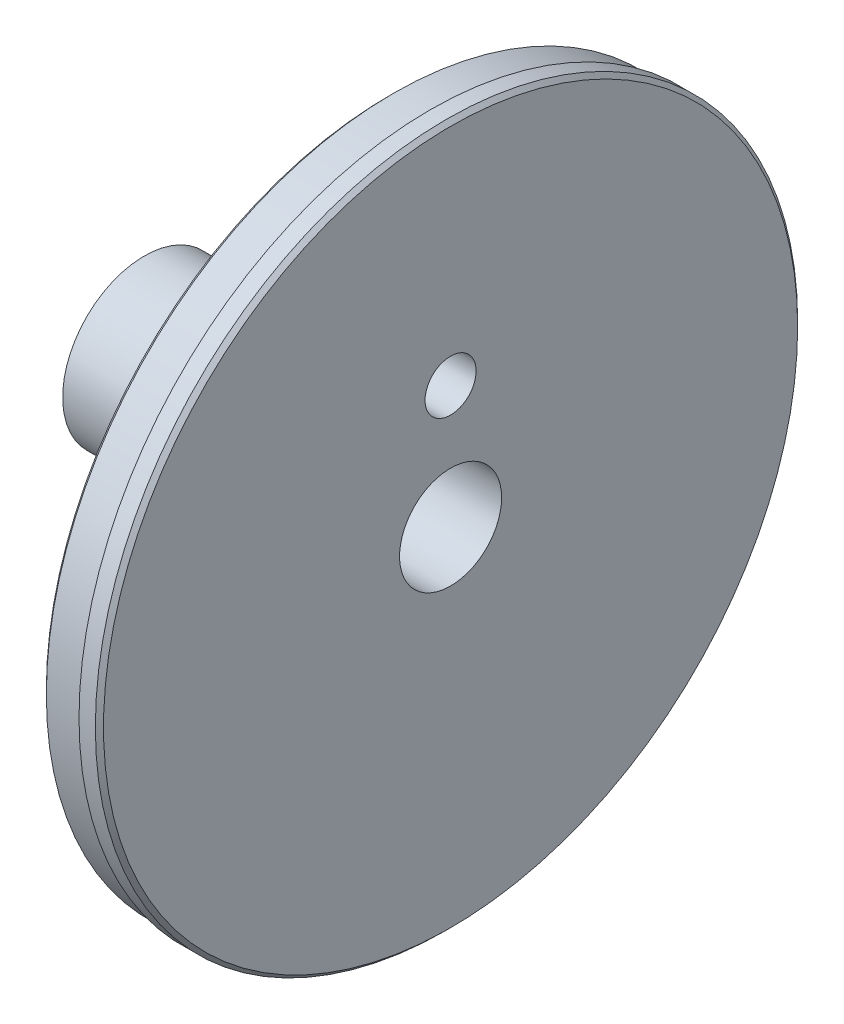
ISO-10303-21;
HEADER;
FILE_DESCRIPTION(('STEP AP214'),'2;1');
FILE_NAME('part.step','',(''),(''),'','','');
FILE_SCHEMA(('AUTOMOTIVE_DESIGN { 1 0 10303 214 1 1 1 1 }'));
ENDSEC;
DATA;
#1=APPLICATION_CONTEXT('core data for automotive mechanical design processes');
#2=APPLICATION_PROTOCOL_DEFINITION('international standard','automotive_design',2000,#1);
#3=PRODUCT_CONTEXT('',#1,'mechanical');
#4=PRODUCT('Part','Part','',(#3));
#5=PRODUCT_RELATED_PRODUCT_CATEGORY('part','',(#4));
#6=PRODUCT_DEFINITION_FORMATION('','',#4);
#7=PRODUCT_DEFINITION_CONTEXT('part definition',#1,'design');
#8=PRODUCT_DEFINITION('design','',#6,#7);
#9=PRODUCT_DEFINITION_SHAPE('','',#8);
#10=(LENGTH_UNIT() NAMED_UNIT(*) SI_UNIT(.MILLI.,.METRE.));
#11=(NAMED_UNIT(*) PLANE_ANGLE_UNIT() SI_UNIT($,.RADIAN.));
#12=(NAMED_UNIT(*) SI_UNIT($,.STERADIAN.) SOLID_ANGLE_UNIT());
#13=UNCERTAINTY_MEASURE_WITH_UNIT(LENGTH_MEASURE(1.E-05),#10,'distance_accuracy_value','');
#14=(GEOMETRIC_REPRESENTATION_CONTEXT(3) GLOBAL_UNCERTAINTY_ASSIGNED_CONTEXT((#13)) GLOBAL_UNIT_ASSIGNED_CONTEXT((#10,
#11,#12)) REPRESENTATION_CONTEXT('',''));
#15=CARTESIAN_POINT('',(0.,0.,0.));
#16=DIRECTION('',(0.,0.,1.));
#17=DIRECTION('',(1.,0.,0.));
#18=AXIS2_PLACEMENT_3D('',#15,#16,#17);
#19=CARTESIAN_POINT('',(0.,0.,0.));
#20=DIRECTION('',(1.,0.,0.));
#21=DIRECTION('',(0.,0.,-1.));
#22=AXIS2_PLACEMENT_3D('',#19,#20,#21);
#23=CYLINDRICAL_SURFACE('',#22,2.5);
#24=CARTESIAN_POINT('',(0.,0.,0.));
#25=DIRECTION('',(1.,0.,0.));
#26=DIRECTION('',(0.,0.,-1.));
#27=AXIS2_PLACEMENT_3D('',#24,#25,#26);
#28=CIRCLE('',#27,2.5);
#29=CARTESIAN_POINT('',(0.,0.,-2.5));
#30=VERTEX_POINT('',#29);
#31=EDGE_CURVE('E54',#30,#30,#28,.T.);
#32=ORIENTED_EDGE('',*,*,#31,.T.);
#33=EDGE_LOOP('',(#32));
#34=FACE_BOUND('',#33,.T.);
#35=CARTESIAN_POINT('',(-15.,0.,0.));
#36=DIRECTION('',(1.,0.,0.));
#37=DIRECTION('',(0.,0.,-1.));
#38=AXIS2_PLACEMENT_3D('',#35,#36,#37);
#39=CIRCLE('',#38,2.5);
#40=CARTESIAN_POINT('',(-15.,0.,-2.5));
#41=VERTEX_POINT('',#40);
#42=EDGE_CURVE('E75',#41,#41,#39,.T.);
#43=ORIENTED_EDGE('',*,*,#42,.F.);
#44=EDGE_LOOP('',(#43));
#45=FACE_BOUND('',#44,.T.);
#46=ADVANCED_FACE('F33',(#34,#45),#23,.F.);
#47=CARTESIAN_POINT('',(0.,2.5,0.));
#48=DIRECTION('',(1.,0.,0.));
#49=DIRECTION('',(0.,0.,-1.));
#50=AXIS2_PLACEMENT_3D('',#47,#48,#49);
#51=PLANE('',#50);
#52=CARTESIAN_POINT('',(0.,0.,0.));
#53=DIRECTION('',(1.,0.,0.));
#54=DIRECTION('',(0.,0.,-1.));
#55=AXIS2_PLACEMENT_3D('',#52,#53,#54);
#56=CIRCLE('',#55,17.);
#57=CARTESIAN_POINT('',(0.,0.,-17.));
#58=VERTEX_POINT('',#57);
#59=EDGE_CURVE('E41',#58,#58,#56,.T.);
#60=ORIENTED_EDGE('',*,*,#59,.T.);
#61=EDGE_LOOP('',(#60));
#62=FACE_BOUND('',#61,.T.);
#63=CARTESIAN_POINT('',(0.,6.,0.));
#64=DIRECTION('',(-1.,0.,0.));
#65=DIRECTION('',(0.,0.,1.));
#66=AXIS2_PLACEMENT_3D('',#63,#64,#65);
#67=CIRCLE('',#66,1.25);
#68=CARTESIAN_POINT('',(0.,6.,1.25));
#69=VERTEX_POINT('',#68);
#70=EDGE_CURVE('E78',#69,#69,#67,.T.);
#71=ORIENTED_EDGE('',*,*,#70,.T.);
#72=EDGE_LOOP('',(#71));
#73=FACE_BOUND('',#72,.T.);
#74=ORIENTED_EDGE('',*,*,#31,.F.);
#75=EDGE_LOOP('',(#74));
#76=FACE_BOUND('',#75,.T.);
#77=ADVANCED_FACE('F85',(#62,#73,#76),#51,.T.);
#78=CARTESIAN_POINT('',(0.,0.,0.));
#79=DIRECTION('',(1.,0.,0.));
#80=DIRECTION('',(0.,0.,-1.));
#81=AXIS2_PLACEMENT_3D('',#78,#79,#80);
#82=CYLINDRICAL_SURFACE('',#81,17.2);
#83=CARTESIAN_POINT('',(-0.200000000000013,0.,0.));
#84=DIRECTION('',(1.,0.,0.));
#85=DIRECTION('',(0.,0.,-1.));
#86=AXIS2_PLACEMENT_3D('',#83,#84,#85);
#87=CIRCLE('',#86,17.2);
#88=CARTESIAN_POINT('',(-0.200000000000013,0.,-17.2));
#89=VERTEX_POINT('',#88);
#90=EDGE_CURVE('E10',#89,#89,#87,.F.);
#91=ORIENTED_EDGE('',*,*,#90,.T.);
#92=EDGE_LOOP('',(#91));
#93=FACE_BOUND('',#92,.T.);
#94=CARTESIAN_POINT('',(-1.,0.,0.));
#95=DIRECTION('',(1.,0.,0.));
#96=DIRECTION('',(0.,0.,-1.));
#97=AXIS2_PLACEMENT_3D('',#94,#95,#96);
#98=CIRCLE('',#97,17.2);
#99=CARTESIAN_POINT('',(-1.,0.,-17.2));
#100=VERTEX_POINT('',#99);
#101=EDGE_CURVE('E57',#100,#100,#98,.T.);
#102=ORIENTED_EDGE('',*,*,#101,.T.);
#103=EDGE_LOOP('',(#102));
#104=FACE_BOUND('',#103,.T.);
#105=ADVANCED_FACE('F130',(#93,#104),#82,.T.);
#106=CARTESIAN_POINT('',(-1.,17.2,0.));
#107=DIRECTION('',(-1.,0.,0.));
#108=DIRECTION('',(0.,0.,1.));
#109=AXIS2_PLACEMENT_3D('',#106,#107,#108);
#110=PLANE('',#109);
#111=CARTESIAN_POINT('',(-1.,0.,0.));
#112=DIRECTION('',(1.,0.,0.));
#113=DIRECTION('',(0.,0.,-1.));
#114=AXIS2_PLACEMENT_3D('',#111,#112,#113);
#115=CIRCLE('',#114,17.);
#116=CARTESIAN_POINT('',(-1.,0.,-17.));
#117=VERTEX_POINT('',#116);
#118=EDGE_CURVE('E60',#117,#117,#115,.T.);
#119=ORIENTED_EDGE('',*,*,#118,.T.);
#120=EDGE_LOOP('',(#119));
#121=FACE_BOUND('',#120,.T.);
#122=ORIENTED_EDGE('',*,*,#101,.F.);
#123=EDGE_LOOP('',(#122));
#124=FACE_BOUND('',#123,.T.);
#125=ADVANCED_FACE('F120',(#121,#124),#110,.T.);
#126=CARTESIAN_POINT('',(0.,0.,0.));
#127=DIRECTION('',(1.,0.,0.));
#128=DIRECTION('',(0.,0.,-1.));
#129=AXIS2_PLACEMENT_3D('',#126,#127,#128);
#130=CYLINDRICAL_SURFACE('',#129,17.);
#131=CARTESIAN_POINT('',(-2.8,0.,0.));
#132=DIRECTION('',(-1.,0.,0.));
#133=DIRECTION('',(0.,0.,1.));
#134=AXIS2_PLACEMENT_3D('',#131,#132,#133);
#135=CIRCLE('',#134,17.);
#136=CARTESIAN_POINT('',(-2.8,0.,17.));
#137=VERTEX_POINT('',#136);
#138=EDGE_CURVE('E49',#137,#137,#135,.F.);
#139=ORIENTED_EDGE('',*,*,#138,.T.);
#140=EDGE_LOOP('',(#139));
#141=FACE_BOUND('',#140,.T.);
#142=ORIENTED_EDGE('',*,*,#118,.F.);
#143=EDGE_LOOP('',(#142));
#144=FACE_BOUND('',#143,.T.);
#145=ADVANCED_FACE('F113',(#141,#144),#130,.T.);
#146=CARTESIAN_POINT('',(-3.,17.,0.));
#147=DIRECTION('',(-1.,0.,0.));
#148=DIRECTION('',(0.,0.,1.));
#149=AXIS2_PLACEMENT_3D('',#146,#147,#148);
#150=PLANE('',#149);
#151=CARTESIAN_POINT('',(-3.,0.,0.));
#152=DIRECTION('',(-1.,0.,0.));
#153=DIRECTION('',(0.,0.,1.));
#154=AXIS2_PLACEMENT_3D('',#151,#152,#153);
#155=CIRCLE('',#154,16.8);
#156=CARTESIAN_POINT('',(-3.,0.,16.8));
#157=VERTEX_POINT('',#156);
#158=EDGE_CURVE('E45',#157,#157,#155,.T.);
#159=ORIENTED_EDGE('',*,*,#158,.T.);
#160=EDGE_LOOP('',(#159));
#161=FACE_BOUND('',#160,.T.);
#162=CARTESIAN_POINT('',(-3.,0.,0.));
#163=DIRECTION('',(1.,0.,0.));
#164=DIRECTION('',(0.,0.,-1.));
#165=AXIS2_PLACEMENT_3D('',#162,#163,#164);
#166=CIRCLE('',#165,9.);
#167=CARTESIAN_POINT('',(-3.,0.,-9.));
#168=VERTEX_POINT('',#167);
#169=EDGE_CURVE('E63',#168,#168,#166,.T.);
#170=ORIENTED_EDGE('',*,*,#169,.T.);
#171=EDGE_LOOP('',(#170));
#172=FACE_BOUND('',#171,.T.);
#173=ADVANCED_FACE('F108',(#161,#172),#150,.T.);
#174=CARTESIAN_POINT('',(0.,0.,0.));
#175=DIRECTION('',(1.,0.,0.));
#176=DIRECTION('',(0.,0.,-1.));
#177=AXIS2_PLACEMENT_3D('',#174,#175,#176);
#178=CYLINDRICAL_SURFACE('',#177,9.);
#179=CARTESIAN_POINT('',(-6.,0.,0.));
#180=DIRECTION('',(1.,0.,0.));
#181=DIRECTION('',(0.,0.,-1.));
#182=AXIS2_PLACEMENT_3D('',#179,#180,#181);
#183=CIRCLE('',#182,9.);
#184=CARTESIAN_POINT('',(-6.,0.,-9.));
#185=VERTEX_POINT('',#184);
#186=EDGE_CURVE('E66',#185,#185,#183,.T.);
#187=ORIENTED_EDGE('',*,*,#186,.T.);
#188=EDGE_LOOP('',(#187));
#189=FACE_BOUND('',#188,.T.);
#190=ORIENTED_EDGE('',*,*,#169,.F.);
#191=EDGE_LOOP('',(#190));
#192=FACE_BOUND('',#191,.T.);
#193=ADVANCED_FACE('F100',(#189,#192),#178,.T.);
#194=CARTESIAN_POINT('',(-6.,9.,0.));
#195=DIRECTION('',(-1.,0.,0.));
#196=DIRECTION('',(0.,0.,1.));
#197=AXIS2_PLACEMENT_3D('',#194,#195,#196);
#198=PLANE('',#197);
#199=CARTESIAN_POINT('',(-6.,6.,0.));
#200=DIRECTION('',(-1.,0.,0.));
#201=DIRECTION('',(0.,0.,1.));
#202=AXIS2_PLACEMENT_3D('',#199,#200,#201);
#203=CIRCLE('',#202,1.25);
#204=CARTESIAN_POINT('',(-6.,6.,1.25));
#205=VERTEX_POINT('',#204);
#206=EDGE_CURVE('E79',#205,#205,#203,.T.);
#207=ORIENTED_EDGE('',*,*,#206,.F.);
#208=EDGE_LOOP('',(#207));
#209=FACE_BOUND('',#208,.T.);
#210=CARTESIAN_POINT('',(-6.,0.,0.));
#211=DIRECTION('',(1.,0.,0.));
#212=DIRECTION('',(0.,0.,-1.));
#213=AXIS2_PLACEMENT_3D('',#210,#211,#212);
#214=CIRCLE('',#213,4.);
#215=CARTESIAN_POINT('',(-6.,0.,-4.));
#216=VERTEX_POINT('',#215);
#217=EDGE_CURVE('E69',#216,#216,#214,.T.);
#218=ORIENTED_EDGE('',*,*,#217,.T.);
#219=EDGE_LOOP('',(#218));
#220=FACE_BOUND('',#219,.T.);
#221=ORIENTED_EDGE('',*,*,#186,.F.);
#222=EDGE_LOOP('',(#221));
#223=FACE_BOUND('',#222,.T.);
#224=ADVANCED_FACE('F96',(#209,#220,#223),#198,.T.);
#225=CARTESIAN_POINT('',(0.,0.,0.));
#226=DIRECTION('',(1.,0.,0.));
#227=DIRECTION('',(0.,0.,-1.));
#228=AXIS2_PLACEMENT_3D('',#225,#226,#227);
#229=CYLINDRICAL_SURFACE('',#228,4.);
#230=CARTESIAN_POINT('',(-15.,0.,0.));
#231=DIRECTION('',(1.,0.,0.));
#232=DIRECTION('',(0.,0.,-1.));
#233=AXIS2_PLACEMENT_3D('',#230,#231,#232);
#234=CIRCLE('',#233,4.);
#235=CARTESIAN_POINT('',(-15.,0.,-4.));
#236=VERTEX_POINT('',#235);
#237=EDGE_CURVE('E72',#236,#236,#234,.T.);
#238=ORIENTED_EDGE('',*,*,#237,.T.);
#239=EDGE_LOOP('',(#238));
#240=FACE_BOUND('',#239,.T.);
#241=ORIENTED_EDGE('',*,*,#217,.F.);
#242=EDGE_LOOP('',(#241));
#243=FACE_BOUND('',#242,.T.);
#244=ADVANCED_FACE('F99',(#240,#243),#229,.T.);
#245=CARTESIAN_POINT('',(-15.,4.,0.));
#246=DIRECTION('',(-1.,0.,0.));
#247=DIRECTION('',(0.,0.,1.));
#248=AXIS2_PLACEMENT_3D('',#245,#246,#247);
#249=PLANE('',#248);
#250=ORIENTED_EDGE('',*,*,#42,.T.);
#251=EDGE_LOOP('',(#250));
#252=FACE_BOUND('',#251,.T.);
#253=ORIENTED_EDGE('',*,*,#237,.F.);
#254=EDGE_LOOP('',(#253));
#255=FACE_BOUND('',#254,.T.);
#256=ADVANCED_FACE('F92',(#252,#255),#249,.T.);
#257=CARTESIAN_POINT('',(0.,6.,0.));
#258=DIRECTION('',(-1.,0.,0.));
#259=DIRECTION('',(0.,0.,1.));
#260=AXIS2_PLACEMENT_3D('',#257,#258,#259);
#261=CYLINDRICAL_SURFACE('',#260,1.25);
#262=ORIENTED_EDGE('',*,*,#70,.F.);
#263=EDGE_LOOP('',(#262));
#264=FACE_BOUND('',#263,.T.);
#265=ORIENTED_EDGE('',*,*,#206,.T.);
#266=EDGE_LOOP('',(#265));
#267=FACE_BOUND('',#266,.T.);
#268=ADVANCED_FACE('F88',(#264,#267),#261,.F.);
#269=CARTESIAN_POINT('',(-2.8,0.,0.));
#270=DIRECTION('',(1.,0.,0.));
#271=DIRECTION('',(0.,0.,-1.));
#272=AXIS2_PLACEMENT_3D('',#269,#270,#271);
#273=CONICAL_SURFACE('',#272,17.,0.785398163397466);
#274=ORIENTED_EDGE('',*,*,#158,.F.);
#275=EDGE_LOOP('',(#274));
#276=FACE_BOUND('',#275,.T.);
#277=ORIENTED_EDGE('',*,*,#138,.F.);
#278=EDGE_LOOP('',(#277));
#279=FACE_BOUND('',#278,.T.);
#280=ADVANCED_FACE('F91',(#276,#279),#273,.T.);
#281=CARTESIAN_POINT('',(0.,0.,0.));
#282=DIRECTION('',(-1.,0.,0.));
#283=DIRECTION('',(0.,0.,1.));
#284=AXIS2_PLACEMENT_3D('',#281,#282,#283);
#285=CONICAL_SURFACE('',#284,17.,0.785398163397431);
#286=ORIENTED_EDGE('',*,*,#90,.F.);
#287=EDGE_LOOP('',(#286));
#288=FACE_BOUND('',#287,.T.);
#289=ORIENTED_EDGE('',*,*,#59,.F.);
#290=EDGE_LOOP('',(#289));
#291=FACE_BOUND('',#290,.T.);
#292=ADVANCED_FACE('F36',(#288,#291),#285,.T.);
#293=CLOSED_SHELL('',(#46,#77,#105,#125,#145,#173,#193,#224,#244,#256,#268,#280,#292));
#294=MANIFOLD_SOLID_BREP('B2',#293);
#295=ADVANCED_BREP_SHAPE_REPRESENTATION('',(#18,#294),#14);
#296=SHAPE_DEFINITION_REPRESENTATION(#9,#295);
ENDSEC;
END-ISO-10303-21;
